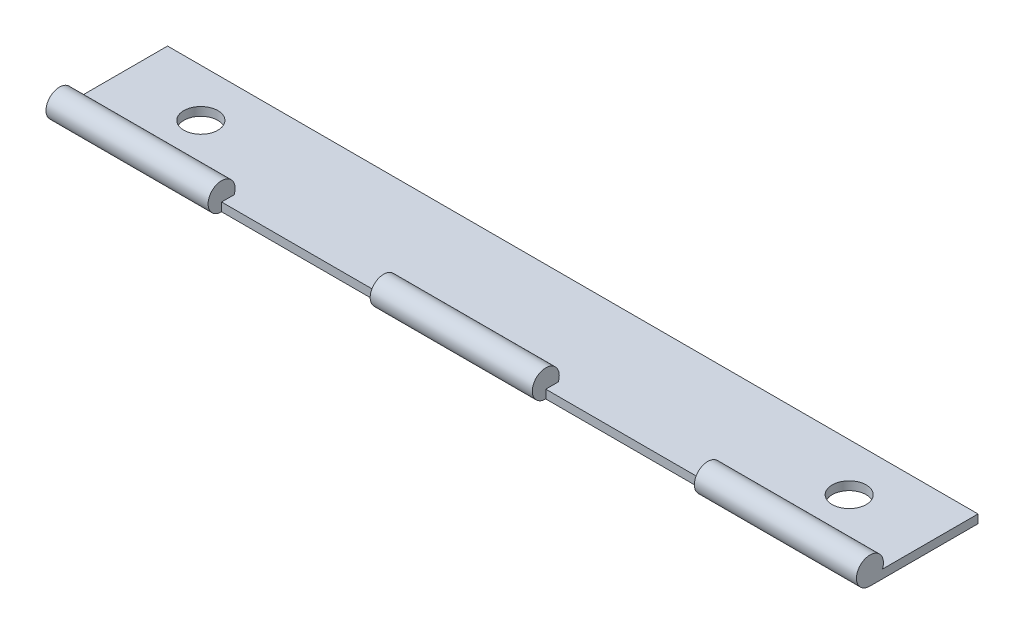
ISO-10303-21;
HEADER;
FILE_DESCRIPTION(('STEP AP214'),'2;1');
FILE_NAME('part.step','',(''),(''),'','','');
FILE_SCHEMA(('AUTOMOTIVE_DESIGN { 1 0 10303 214 1 1 1 1 }'));
ENDSEC;
DATA;
#1=APPLICATION_CONTEXT('core data for automotive mechanical design processes');
#2=APPLICATION_PROTOCOL_DEFINITION('international standard','automotive_design',2000,#1);
#3=PRODUCT_CONTEXT('',#1,'mechanical');
#4=PRODUCT('Part','Part','',(#3));
#5=PRODUCT_RELATED_PRODUCT_CATEGORY('part','',(#4));
#6=PRODUCT_DEFINITION_FORMATION('','',#4);
#7=PRODUCT_DEFINITION_CONTEXT('part definition',#1,'design');
#8=PRODUCT_DEFINITION('design','',#6,#7);
#9=PRODUCT_DEFINITION_SHAPE('','',#8);
#10=(LENGTH_UNIT() NAMED_UNIT(*) SI_UNIT(.MILLI.,.METRE.));
#11=(NAMED_UNIT(*) PLANE_ANGLE_UNIT() SI_UNIT($,.RADIAN.));
#12=(NAMED_UNIT(*) SI_UNIT($,.STERADIAN.) SOLID_ANGLE_UNIT());
#13=UNCERTAINTY_MEASURE_WITH_UNIT(LENGTH_MEASURE(1.E-05),#10,'distance_accuracy_value','');
#14=(GEOMETRIC_REPRESENTATION_CONTEXT(3) GLOBAL_UNCERTAINTY_ASSIGNED_CONTEXT((#13)) GLOBAL_UNIT_ASSIGNED_CONTEXT((#10,
#11,#12)) REPRESENTATION_CONTEXT('',''));
#15=CARTESIAN_POINT('',(0.,0.,0.));
#16=DIRECTION('',(0.,0.,1.));
#17=DIRECTION('',(1.,0.,0.));
#18=AXIS2_PLACEMENT_3D('',#15,#16,#17);
#19=CARTESIAN_POINT('',(0.,1.,0.));
#20=DIRECTION('',(0.,0.,-1.));
#21=DIRECTION('',(-1.,0.,0.));
#22=AXIS2_PLACEMENT_3D('',#19,#20,#21);
#23=PLANE('',#22);
#24=DIRECTION('',(0.,1.,0.));
#25=VECTOR('',#24,1.);
#26=CARTESIAN_POINT('',(57.15,1.,0.));
#27=LINE('',#26,#25);
#28=CARTESIAN_POINT('',(57.15,0.,0.));
#29=VERTEX_POINT('',#28);
#30=CARTESIAN_POINT('',(57.15,1.,0.));
#31=VERTEX_POINT('',#30);
#32=EDGE_CURVE('E156',#29,#31,#27,.T.);
#33=ORIENTED_EDGE('',*,*,#32,.F.);
#34=DIRECTION('',(1.,0.,0.));
#35=VECTOR('',#34,1.);
#36=CARTESIAN_POINT('',(0.,0.,0.));
#37=LINE('',#36,#35);
#38=CARTESIAN_POINT('',(76.2,0.,0.));
#39=VERTEX_POINT('',#38);
#40=EDGE_CURVE('E187',#29,#39,#37,.T.);
#41=ORIENTED_EDGE('',*,*,#40,.T.);
#42=DIRECTION('',(0.,-1.,0.));
#43=VECTOR('',#42,1.);
#44=CARTESIAN_POINT('',(76.2,1.,0.));
#45=LINE('',#44,#43);
#46=CARTESIAN_POINT('',(76.2,1.,0.));
#47=VERTEX_POINT('',#46);
#48=EDGE_CURVE('E161',#47,#39,#45,.T.);
#49=ORIENTED_EDGE('',*,*,#48,.F.);
#50=DIRECTION('',(1.,0.,0.));
#51=VECTOR('',#50,1.);
#52=CARTESIAN_POINT('',(0.,1.,0.));
#53=LINE('',#52,#51);
#54=EDGE_CURVE('E181',#31,#47,#53,.T.);
#55=ORIENTED_EDGE('',*,*,#54,.F.);
#56=EDGE_LOOP('',(#33,#41,#49,#55));
#57=FACE_BOUND('',#56,.T.);
#58=ADVANCED_FACE('F33',(#57),#23,.F.);
#59=CARTESIAN_POINT('',(0.,1.,0.));
#60=DIRECTION('',(0.,-1.,0.));
#61=DIRECTION('',(0.,0.,-1.));
#62=AXIS2_PLACEMENT_3D('',#59,#60,#61);
#63=PLANE('',#62);
#64=CARTESIAN_POINT('',(85.725,1.,-7.08739406018764));
#65=DIRECTION('',(0.,1.,0.));
#66=DIRECTION('',(0.,0.,1.));
#67=AXIS2_PLACEMENT_3D('',#64,#65,#66);
#68=CIRCLE('',#67,2.);
#69=CARTESIAN_POINT('',(85.725,1.,-5.08739406018764));
#70=VERTEX_POINT('',#69);
#71=EDGE_CURVE('E194',#70,#70,#68,.T.);
#72=ORIENTED_EDGE('',*,*,#71,.F.);
#73=EDGE_LOOP('',(#72));
#74=FACE_BOUND('',#73,.T.);
#75=CARTESIAN_POINT('',(9.52500000000001,1.,-7.08739406018764));
#76=DIRECTION('',(0.,1.,0.));
#77=DIRECTION('',(0.,0.,-1.));
#78=AXIS2_PLACEMENT_3D('',#75,#76,#77);
#79=CIRCLE('',#78,2.);
#80=CARTESIAN_POINT('',(9.52500000000001,1.,-5.08739406018764));
#81=VERTEX_POINT('',#80);
#82=EDGE_CURVE('E135',#81,#81,#79,.T.);
#83=ORIENTED_EDGE('',*,*,#82,.F.);
#84=EDGE_LOOP('',(#83));
#85=FACE_BOUND('',#84,.T.);
#86=DIRECTION('',(0.,0.,-1.));
#87=VECTOR('',#86,1.);
#88=CARTESIAN_POINT('',(57.15,1.,0.));
#89=LINE('',#88,#87);
#90=CARTESIAN_POINT('',(57.15,1.,-1.47478812037526));
#91=VERTEX_POINT('',#90);
#92=EDGE_CURVE('E154',#31,#91,#89,.T.);
#93=ORIENTED_EDGE('',*,*,#92,.F.);
#94=ORIENTED_EDGE('',*,*,#54,.T.);
#95=DIRECTION('',(0.,0.,-1.));
#96=VECTOR('',#95,1.);
#97=CARTESIAN_POINT('',(76.2,1.,0.));
#98=LINE('',#97,#96);
#99=CARTESIAN_POINT('',(76.2,1.,-1.47478812037527));
#100=VERTEX_POINT('',#99);
#101=EDGE_CURVE('E50',#47,#100,#98,.T.);
#102=ORIENTED_EDGE('',*,*,#101,.T.);
#103=DIRECTION('',(-1.,0.,0.));
#104=VECTOR('',#103,1.);
#105=CARTESIAN_POINT('',(95.25,0.999999999999999,-1.47478812037527));
#106=LINE('',#105,#104);
#107=CARTESIAN_POINT('',(95.25,0.999999999999999,-1.47478812037527));
#108=VERTEX_POINT('',#107);
#109=EDGE_CURVE('E121',#108,#100,#106,.T.);
#110=ORIENTED_EDGE('',*,*,#109,.F.);
#111=DIRECTION('',(0.,0.,1.));
#112=VECTOR('',#111,1.);
#113=CARTESIAN_POINT('',(95.25,1.,-12.7));
#114=LINE('',#113,#112);
#115=CARTESIAN_POINT('',(95.25,1.,-12.7));
#116=VERTEX_POINT('',#115);
#117=EDGE_CURVE('E119',#116,#108,#114,.T.);
#118=ORIENTED_EDGE('',*,*,#117,.F.);
#119=DIRECTION('',(-1.,0.,0.));
#120=VECTOR('',#119,1.);
#121=CARTESIAN_POINT('',(0.,1.,-12.7));
#122=LINE('',#121,#120);
#123=CARTESIAN_POINT('',(0.,1.,-12.7));
#124=VERTEX_POINT('',#123);
#125=EDGE_CURVE('E42',#116,#124,#122,.T.);
#126=ORIENTED_EDGE('',*,*,#125,.T.);
#127=DIRECTION('',(0.,0.,1.));
#128=VECTOR('',#127,1.);
#129=CARTESIAN_POINT('',(0.,1.,0.));
#130=LINE('',#129,#128);
#131=CARTESIAN_POINT('',(0.,1.,-1.47478812037526));
#132=VERTEX_POINT('',#131);
#133=EDGE_CURVE('E179',#124,#132,#130,.T.);
#134=ORIENTED_EDGE('',*,*,#133,.T.);
#135=DIRECTION('',(-1.,0.,0.));
#136=VECTOR('',#135,1.);
#137=CARTESIAN_POINT('',(19.05,1.,-1.47478812037526));
#138=LINE('',#137,#136);
#139=CARTESIAN_POINT('',(19.05,1.,-1.47478812037526));
#140=VERTEX_POINT('',#139);
#141=EDGE_CURVE('E176',#132,#140,#138,.F.);
#142=ORIENTED_EDGE('',*,*,#141,.T.);
#143=DIRECTION('',(0.,0.,-1.));
#144=VECTOR('',#143,1.);
#145=CARTESIAN_POINT('',(19.05,1.,0.));
#146=LINE('',#145,#144);
#147=CARTESIAN_POINT('',(19.05,1.,0.));
#148=VERTEX_POINT('',#147);
#149=EDGE_CURVE('E168',#148,#140,#146,.T.);
#150=ORIENTED_EDGE('',*,*,#149,.F.);
#151=CARTESIAN_POINT('',(38.1,1.,0.));
#152=VERTEX_POINT('',#151);
#153=EDGE_CURVE('E117',#148,#152,#53,.T.);
#154=ORIENTED_EDGE('',*,*,#153,.T.);
#155=DIRECTION('',(0.,0.,-1.));
#156=VECTOR('',#155,1.);
#157=CARTESIAN_POINT('',(38.1,1.,0.));
#158=LINE('',#157,#156);
#159=CARTESIAN_POINT('',(38.1,1.,-1.47478812037526));
#160=VERTEX_POINT('',#159);
#161=EDGE_CURVE('E148',#152,#160,#158,.T.);
#162=ORIENTED_EDGE('',*,*,#161,.T.);
#163=DIRECTION('',(-1.,0.,0.));
#164=VECTOR('',#163,1.);
#165=CARTESIAN_POINT('',(57.15,1.,-1.47478812037526));
#166=LINE('',#165,#164);
#167=EDGE_CURVE('E57',#160,#91,#166,.F.);
#168=ORIENTED_EDGE('',*,*,#167,.T.);
#169=EDGE_LOOP('',(#93,#94,#102,#110,#118,#126,#134,#142,#150,#154,#162,#168));
#170=FACE_BOUND('',#169,.T.);
#171=ADVANCED_FACE('F120',(#74,#85,#170),#63,.F.);
#172=CARTESIAN_POINT('',(19.05,0.,0.));
#173=VERTEX_POINT('',#172);
#174=CARTESIAN_POINT('',(38.1,0.,0.));
#175=VERTEX_POINT('',#174);
#176=EDGE_CURVE('E191',#173,#175,#37,.T.);
#177=ORIENTED_EDGE('',*,*,#176,.T.);
#178=DIRECTION('',(0.,1.,0.));
#179=VECTOR('',#178,1.);
#180=CARTESIAN_POINT('',(38.1,1.,0.));
#181=LINE('',#180,#179);
#182=EDGE_CURVE('E152',#175,#152,#181,.T.);
#183=ORIENTED_EDGE('',*,*,#182,.T.);
#184=ORIENTED_EDGE('',*,*,#153,.F.);
#185=DIRECTION('',(0.,1.,0.));
#186=VECTOR('',#185,1.);
#187=CARTESIAN_POINT('',(19.05,1.,0.));
#188=LINE('',#187,#186);
#189=EDGE_CURVE('E173',#173,#148,#188,.T.);
#190=ORIENTED_EDGE('',*,*,#189,.F.);
#191=EDGE_LOOP('',(#177,#183,#184,#190));
#192=FACE_BOUND('',#191,.T.);
#193=ADVANCED_FACE('F207',(#192),#23,.F.);
#194=CARTESIAN_POINT('',(0.,1.,0.));
#195=DIRECTION('',(1.,0.,0.));
#196=DIRECTION('',(0.,0.,-1.));
#197=AXIS2_PLACEMENT_3D('',#194,#195,#196);
#198=PLANE('',#197);
#199=DIRECTION('',(0.,0.,1.));
#200=VECTOR('',#199,1.);
#201=CARTESIAN_POINT('',(0.,0.,0.));
#202=LINE('',#201,#200);
#203=CARTESIAN_POINT('',(0.,0.,-12.7));
#204=VERTEX_POINT('',#203);
#205=CARTESIAN_POINT('',(0.,0.,0.));
#206=VERTEX_POINT('',#205);
#207=EDGE_CURVE('E178',#204,#206,#202,.T.);
#208=ORIENTED_EDGE('',*,*,#207,.T.);
#209=CARTESIAN_POINT('',(0.,1.5875,0.));
#210=DIRECTION('',(-1.,0.,0.));
#211=DIRECTION('',(0.,0.,1.));
#212=AXIS2_PLACEMENT_3D('',#209,#210,#211);
#213=CIRCLE('',#212,1.5875);
#214=EDGE_CURVE('E164',#206,#132,#213,.T.);
#215=ORIENTED_EDGE('',*,*,#214,.T.);
#216=ORIENTED_EDGE('',*,*,#133,.F.);
#217=DIRECTION('',(0.,-1.,0.));
#218=VECTOR('',#217,1.);
#219=CARTESIAN_POINT('',(0.,1.,-12.7));
#220=LINE('',#219,#218);
#221=EDGE_CURVE('E11',#124,#204,#220,.T.);
#222=ORIENTED_EDGE('',*,*,#221,.T.);
#223=EDGE_LOOP('',(#208,#215,#216,#222));
#224=FACE_BOUND('',#223,.T.);
#225=ADVANCED_FACE('F35',(#224),#198,.F.);
#226=CARTESIAN_POINT('',(0.,1.,-12.7));
#227=DIRECTION('',(0.,0.,1.));
#228=DIRECTION('',(1.,0.,0.));
#229=AXIS2_PLACEMENT_3D('',#226,#227,#228);
#230=PLANE('',#229);
#231=DIRECTION('',(-1.,0.,0.));
#232=VECTOR('',#231,1.);
#233=CARTESIAN_POINT('',(0.,0.,-12.7));
#234=LINE('',#233,#232);
#235=CARTESIAN_POINT('',(95.25,0.,-12.7));
#236=VERTEX_POINT('',#235);
#237=EDGE_CURVE('E182',#236,#204,#234,.T.);
#238=ORIENTED_EDGE('',*,*,#237,.T.);
#239=ORIENTED_EDGE('',*,*,#221,.F.);
#240=ORIENTED_EDGE('',*,*,#125,.F.);
#241=DIRECTION('',(0.,1.,0.));
#242=VECTOR('',#241,1.);
#243=CARTESIAN_POINT('',(95.25,0.,-12.7));
#244=LINE('',#243,#242);
#245=EDGE_CURVE('E115',#236,#116,#244,.T.);
#246=ORIENTED_EDGE('',*,*,#245,.F.);
#247=EDGE_LOOP('',(#238,#239,#240,#246));
#248=FACE_BOUND('',#247,.T.);
#249=ADVANCED_FACE('F113',(#248),#230,.F.);
#250=CARTESIAN_POINT('',(0.,0.,0.));
#251=DIRECTION('',(0.,-1.,0.));
#252=DIRECTION('',(0.,0.,-1.));
#253=AXIS2_PLACEMENT_3D('',#250,#251,#252);
#254=PLANE('',#253);
#255=CARTESIAN_POINT('',(85.725,0.,-7.08739406018764));
#256=DIRECTION('',(0.,-1.,0.));
#257=DIRECTION('',(0.,0.,-1.));
#258=AXIS2_PLACEMENT_3D('',#255,#256,#257);
#259=CIRCLE('',#258,2.);
#260=CARTESIAN_POINT('',(85.725,0.,-5.08739406018764));
#261=VERTEX_POINT('',#260);
#262=EDGE_CURVE('E37',#261,#261,#259,.T.);
#263=ORIENTED_EDGE('',*,*,#262,.F.);
#264=EDGE_LOOP('',(#263));
#265=FACE_BOUND('',#264,.T.);
#266=CARTESIAN_POINT('',(9.52500000000001,0.,-7.08739406018764));
#267=DIRECTION('',(0.,-1.,0.));
#268=DIRECTION('',(0.,0.,-1.));
#269=AXIS2_PLACEMENT_3D('',#266,#267,#268);
#270=CIRCLE('',#269,2.);
#271=CARTESIAN_POINT('',(9.52500000000001,0.,-5.08739406018764));
#272=VERTEX_POINT('',#271);
#273=EDGE_CURVE('E192',#272,#272,#270,.T.);
#274=ORIENTED_EDGE('',*,*,#273,.F.);
#275=EDGE_LOOP('',(#274));
#276=FACE_BOUND('',#275,.T.);
#277=ORIENTED_EDGE('',*,*,#207,.F.);
#278=ORIENTED_EDGE('',*,*,#237,.F.);
#279=DIRECTION('',(0.,0.,-1.));
#280=VECTOR('',#279,1.);
#281=CARTESIAN_POINT('',(95.25,0.,-12.7));
#282=LINE('',#281,#280);
#283=CARTESIAN_POINT('',(95.25,0.,0.));
#284=VERTEX_POINT('',#283);
#285=EDGE_CURVE('E129',#284,#236,#282,.T.);
#286=ORIENTED_EDGE('',*,*,#285,.F.);
#287=DIRECTION('',(-1.,0.,0.));
#288=VECTOR('',#287,1.);
#289=CARTESIAN_POINT('',(95.25,0.,0.));
#290=LINE('',#289,#288);
#291=EDGE_CURVE('E139',#284,#39,#290,.T.);
#292=ORIENTED_EDGE('',*,*,#291,.T.);
#293=ORIENTED_EDGE('',*,*,#40,.F.);
#294=EDGE_CURVE('E252',#175,#29,#37,.T.);
#295=ORIENTED_EDGE('',*,*,#294,.F.);
#296=ORIENTED_EDGE('',*,*,#176,.F.);
#297=EDGE_CURVE('E188',#206,#173,#37,.T.);
#298=ORIENTED_EDGE('',*,*,#297,.F.);
#299=EDGE_LOOP('',(#277,#278,#286,#292,#293,#295,#296,#298));
#300=FACE_BOUND('',#299,.T.);
#301=ADVANCED_FACE('F222',(#265,#276,#300),#254,.T.);
#302=CARTESIAN_POINT('',(19.05,1.5875,0.));
#303=DIRECTION('',(-1.,0.,0.));
#304=DIRECTION('',(0.,0.,1.));
#305=AXIS2_PLACEMENT_3D('',#302,#303,#304);
#306=CYLINDRICAL_SURFACE('',#305,1.5875);
#307=ORIENTED_EDGE('',*,*,#141,.F.);
#308=ORIENTED_EDGE('',*,*,#214,.F.);
#309=ORIENTED_EDGE('',*,*,#297,.T.);
#310=CARTESIAN_POINT('',(19.05,1.5875,0.));
#311=DIRECTION('',(-1.,0.,0.));
#312=DIRECTION('',(0.,0.,1.));
#313=AXIS2_PLACEMENT_3D('',#310,#311,#312);
#314=CIRCLE('',#313,1.5875);
#315=EDGE_CURVE('E165',#173,#140,#314,.T.);
#316=ORIENTED_EDGE('',*,*,#315,.T.);
#317=EDGE_LOOP('',(#307,#308,#309,#316));
#318=FACE_BOUND('',#317,.T.);
#319=ADVANCED_FACE('F220',(#318),#306,.T.);
#320=CARTESIAN_POINT('',(19.05,1.5875,0.));
#321=DIRECTION('',(-1.,0.,0.));
#322=DIRECTION('',(0.,0.,1.));
#323=AXIS2_PLACEMENT_3D('',#320,#321,#322);
#324=PLANE('',#323);
#325=ORIENTED_EDGE('',*,*,#315,.F.);
#326=ORIENTED_EDGE('',*,*,#189,.T.);
#327=ORIENTED_EDGE('',*,*,#149,.T.);
#328=EDGE_LOOP('',(#325,#326,#327));
#329=FACE_BOUND('',#328,.T.);
#330=ADVANCED_FACE('F241',(#329),#324,.F.);
#331=CARTESIAN_POINT('',(57.15,1.5875,0.));
#332=DIRECTION('',(-1.,0.,0.));
#333=DIRECTION('',(0.,0.,1.));
#334=AXIS2_PLACEMENT_3D('',#331,#332,#333);
#335=CYLINDRICAL_SURFACE('',#334,1.5875);
#336=ORIENTED_EDGE('',*,*,#167,.F.);
#337=CARTESIAN_POINT('',(38.1,1.5875,0.));
#338=DIRECTION('',(-1.,0.,0.));
#339=DIRECTION('',(0.,0.,1.));
#340=AXIS2_PLACEMENT_3D('',#337,#338,#339);
#341=CIRCLE('',#340,1.5875);
#342=EDGE_CURVE('E144',#175,#160,#341,.T.);
#343=ORIENTED_EDGE('',*,*,#342,.F.);
#344=ORIENTED_EDGE('',*,*,#294,.T.);
#345=CARTESIAN_POINT('',(57.15,1.5875,0.));
#346=DIRECTION('',(-1.,0.,0.));
#347=DIRECTION('',(0.,0.,1.));
#348=AXIS2_PLACEMENT_3D('',#345,#346,#347);
#349=CIRCLE('',#348,1.5875);
#350=EDGE_CURVE('E145',#29,#91,#349,.T.);
#351=ORIENTED_EDGE('',*,*,#350,.T.);
#352=EDGE_LOOP('',(#336,#343,#344,#351));
#353=FACE_BOUND('',#352,.T.);
#354=ADVANCED_FACE('F251',(#353),#335,.T.);
#355=CARTESIAN_POINT('',(57.15,1.5875,0.));
#356=DIRECTION('',(-1.,0.,0.));
#357=DIRECTION('',(0.,0.,1.));
#358=AXIS2_PLACEMENT_3D('',#355,#356,#357);
#359=PLANE('',#358);
#360=ORIENTED_EDGE('',*,*,#350,.F.);
#361=ORIENTED_EDGE('',*,*,#32,.T.);
#362=ORIENTED_EDGE('',*,*,#92,.T.);
#363=EDGE_LOOP('',(#360,#361,#362));
#364=FACE_BOUND('',#363,.T.);
#365=ADVANCED_FACE('F255',(#364),#359,.F.);
#366=CARTESIAN_POINT('',(38.1,1.5875,0.));
#367=DIRECTION('',(-1.,0.,0.));
#368=DIRECTION('',(0.,0.,1.));
#369=AXIS2_PLACEMENT_3D('',#366,#367,#368);
#370=PLANE('',#369);
#371=ORIENTED_EDGE('',*,*,#182,.F.);
#372=ORIENTED_EDGE('',*,*,#342,.T.);
#373=ORIENTED_EDGE('',*,*,#161,.F.);
#374=EDGE_LOOP('',(#371,#372,#373));
#375=FACE_BOUND('',#374,.T.);
#376=ADVANCED_FACE('F247',(#375),#370,.T.);
#377=CARTESIAN_POINT('',(76.2,1.5875,0.));
#378=DIRECTION('',(1.,0.,0.));
#379=DIRECTION('',(0.,0.,-1.));
#380=AXIS2_PLACEMENT_3D('',#377,#378,#379);
#381=PLANE('',#380);
#382=ORIENTED_EDGE('',*,*,#101,.F.);
#383=ORIENTED_EDGE('',*,*,#48,.T.);
#384=CARTESIAN_POINT('',(76.2,1.5875,0.));
#385=DIRECTION('',(1.,0.,0.));
#386=DIRECTION('',(0.,0.,-1.));
#387=AXIS2_PLACEMENT_3D('',#384,#385,#386);
#388=CIRCLE('',#387,1.5875);
#389=EDGE_CURVE('E130',#100,#39,#388,.T.);
#390=ORIENTED_EDGE('',*,*,#389,.F.);
#391=EDGE_LOOP('',(#382,#383,#390));
#392=FACE_BOUND('',#391,.T.);
#393=ADVANCED_FACE('F261',(#392),#381,.F.);
#394=CARTESIAN_POINT('',(95.25,1.5875,0.));
#395=DIRECTION('',(-1.,0.,0.));
#396=DIRECTION('',(0.,0.,1.));
#397=AXIS2_PLACEMENT_3D('',#394,#395,#396);
#398=CYLINDRICAL_SURFACE('',#397,1.5875);
#399=ORIENTED_EDGE('',*,*,#389,.T.);
#400=ORIENTED_EDGE('',*,*,#291,.F.);
#401=CARTESIAN_POINT('',(95.25,1.5875,0.));
#402=DIRECTION('',(1.,0.,0.));
#403=DIRECTION('',(0.,0.,-1.));
#404=AXIS2_PLACEMENT_3D('',#401,#402,#403);
#405=CIRCLE('',#404,1.5875);
#406=EDGE_CURVE('E124',#108,#284,#405,.T.);
#407=ORIENTED_EDGE('',*,*,#406,.F.);
#408=ORIENTED_EDGE('',*,*,#109,.T.);
#409=EDGE_LOOP('',(#399,#400,#407,#408));
#410=FACE_BOUND('',#409,.T.);
#411=ADVANCED_FACE('F264',(#410),#398,.T.);
#412=CARTESIAN_POINT('',(95.25,1.5875,0.));
#413=DIRECTION('',(1.,0.,0.));
#414=DIRECTION('',(0.,0.,-1.));
#415=AXIS2_PLACEMENT_3D('',#412,#413,#414);
#416=PLANE('',#415);
#417=ORIENTED_EDGE('',*,*,#245,.T.);
#418=ORIENTED_EDGE('',*,*,#117,.T.);
#419=ORIENTED_EDGE('',*,*,#406,.T.);
#420=ORIENTED_EDGE('',*,*,#285,.T.);
#421=EDGE_LOOP('',(#417,#418,#419,#420));
#422=FACE_BOUND('',#421,.T.);
#423=ADVANCED_FACE('F127',(#422),#416,.T.);
#424=CARTESIAN_POINT('',(9.52500000000001,-18.05,-7.08739406018764));
#425=DIRECTION('',(0.,1.,0.));
#426=DIRECTION('',(0.,0.,1.));
#427=AXIS2_PLACEMENT_3D('',#424,#425,#426);
#428=CYLINDRICAL_SURFACE('',#427,2.);
#429=CARTESIAN_POINT('',(9.52500000000001,0.,-5.08739406018764));
#430=CARTESIAN_POINT('',(9.52500000000001,0.0104166666666667,-5.08739406018764));
#431=CARTESIAN_POINT('',(9.52500000000001,0.0208333333333333,-5.08739406018764));
#432=CARTESIAN_POINT('',(9.52500000000001,0.0416666666666667,-5.08739406018764));
#433=CARTESIAN_POINT('',(9.52500000000001,0.0520833333333334,-5.08739406018764));
#434=CARTESIAN_POINT('',(9.52500000000001,0.0729166666666667,-5.08739406018764));
#435=CARTESIAN_POINT('',(9.52500000000001,0.0833333333333334,-5.08739406018764));
#436=CARTESIAN_POINT('',(9.52500000000001,0.104166666666667,-5.08739406018764));
#437=CARTESIAN_POINT('',(9.52500000000001,0.114583333333333,-5.08739406018764));
#438=CARTESIAN_POINT('',(9.52500000000001,0.135416666666667,-5.08739406018764));
#439=CARTESIAN_POINT('',(9.52500000000001,0.145833333333333,-5.08739406018764));
#440=CARTESIAN_POINT('',(9.52500000000001,0.166666666666667,-5.08739406018764));
#441=CARTESIAN_POINT('',(9.52500000000001,0.177083333333333,-5.08739406018764));
#442=CARTESIAN_POINT('',(9.52500000000001,0.197916666666667,-5.08739406018764));
#443=CARTESIAN_POINT('',(9.52500000000001,0.208333333333334,-5.08739406018764));
#444=CARTESIAN_POINT('',(9.52500000000001,0.229166666666667,-5.08739406018764));
#445=CARTESIAN_POINT('',(9.52500000000001,0.239583333333334,-5.08739406018764));
#446=CARTESIAN_POINT('',(9.52500000000001,0.260416666666667,-5.08739406018764));
#447=CARTESIAN_POINT('',(9.52500000000001,0.270833333333334,-5.08739406018764));
#448=CARTESIAN_POINT('',(9.52500000000001,0.291666666666667,-5.08739406018764));
#449=CARTESIAN_POINT('',(9.52500000000001,0.302083333333334,-5.08739406018764));
#450=CARTESIAN_POINT('',(9.52500000000001,0.322916666666667,-5.08739406018764));
#451=CARTESIAN_POINT('',(9.52500000000001,0.333333333333334,-5.08739406018764));
#452=CARTESIAN_POINT('',(9.52500000000001,0.354166666666667,-5.08739406018764));
#453=CARTESIAN_POINT('',(9.52500000000001,0.364583333333334,-5.08739406018764));
#454=CARTESIAN_POINT('',(9.52500000000001,0.385416666666667,-5.08739406018764));
#455=CARTESIAN_POINT('',(9.52500000000001,0.395833333333334,-5.08739406018764));
#456=CARTESIAN_POINT('',(9.52500000000001,0.416666666666667,-5.08739406018764));
#457=CARTESIAN_POINT('',(9.52500000000001,0.427083333333334,-5.08739406018764));
#458=CARTESIAN_POINT('',(9.52500000000001,0.447916666666667,-5.08739406018764));
#459=CARTESIAN_POINT('',(9.52500000000001,0.458333333333334,-5.08739406018764));
#460=CARTESIAN_POINT('',(9.52500000000001,0.479166666666667,-5.08739406018764));
#461=CARTESIAN_POINT('',(9.52500000000001,0.489583333333334,-5.08739406018764));
#462=CARTESIAN_POINT('',(9.52500000000001,0.510416666666667,-5.08739406018764));
#463=CARTESIAN_POINT('',(9.52500000000001,0.520833333333334,-5.08739406018764));
#464=CARTESIAN_POINT('',(9.52500000000001,0.541666666666667,-5.08739406018764));
#465=CARTESIAN_POINT('',(9.52500000000001,0.552083333333334,-5.08739406018764));
#466=CARTESIAN_POINT('',(9.52500000000001,0.572916666666667,-5.08739406018764));
#467=CARTESIAN_POINT('',(9.52500000000001,0.583333333333334,-5.08739406018764));
#468=CARTESIAN_POINT('',(9.52500000000001,0.604166666666667,-5.08739406018764));
#469=CARTESIAN_POINT('',(9.52500000000001,0.614583333333334,-5.08739406018764));
#470=CARTESIAN_POINT('',(9.52500000000001,0.635416666666667,-5.08739406018764));
#471=CARTESIAN_POINT('',(9.52500000000001,0.645833333333334,-5.08739406018764));
#472=CARTESIAN_POINT('',(9.52500000000001,0.666666666666667,-5.08739406018764));
#473=CARTESIAN_POINT('',(9.52500000000001,0.677083333333334,-5.08739406018764));
#474=CARTESIAN_POINT('',(9.52500000000001,0.697916666666667,-5.08739406018764));
#475=CARTESIAN_POINT('',(9.52500000000001,0.708333333333334,-5.08739406018764));
#476=CARTESIAN_POINT('',(9.52500000000001,0.729166666666667,-5.08739406018764));
#477=CARTESIAN_POINT('',(9.52500000000001,0.739583333333334,-5.08739406018764));
#478=CARTESIAN_POINT('',(9.52500000000001,0.760416666666667,-5.08739406018764));
#479=CARTESIAN_POINT('',(9.52500000000001,0.770833333333334,-5.08739406018764));
#480=CARTESIAN_POINT('',(9.52500000000001,0.791666666666667,-5.08739406018764));
#481=CARTESIAN_POINT('',(9.52500000000001,0.802083333333334,-5.08739406018764));
#482=CARTESIAN_POINT('',(9.52500000000001,0.822916666666667,-5.08739406018764));
#483=CARTESIAN_POINT('',(9.52500000000001,0.833333333333334,-5.08739406018764));
#484=CARTESIAN_POINT('',(9.52500000000001,0.854166666666667,-5.08739406018764));
#485=CARTESIAN_POINT('',(9.52500000000001,0.864583333333334,-5.08739406018764));
#486=CARTESIAN_POINT('',(9.52500000000001,0.885416666666668,-5.08739406018764));
#487=CARTESIAN_POINT('',(9.52500000000001,0.895833333333334,-5.08739406018764));
#488=CARTESIAN_POINT('',(9.52500000000001,0.916666666666668,-5.08739406018764));
#489=CARTESIAN_POINT('',(9.52500000000001,0.927083333333334,-5.08739406018764));
#490=CARTESIAN_POINT('',(9.52500000000001,0.947916666666668,-5.08739406018764));
#491=CARTESIAN_POINT('',(9.52500000000001,0.958333333333334,-5.08739406018764));
#492=CARTESIAN_POINT('',(9.52500000000001,0.979166666666668,-5.08739406018764));
#493=CARTESIAN_POINT('',(9.52500000000001,0.989583333333334,-5.08739406018764));
#494=CARTESIAN_POINT('',(9.52500000000001,1.,-5.08739406018764));
#495=B_SPLINE_CURVE_WITH_KNOTS('',3,(#429,#430,#431,#432,#433,#434,#435,#436,#437,#438,#439,
#440,#441,#442,#443,#444,#445,#446,#447,#448,#449,#450,#451,#452,#453,#454,#455,#456,#457,#458,
#459,#460,#461,#462,#463,#464,#465,#466,#467,#468,#469,#470,#471,#472,#473,#474,#475,#476,#477,
#478,#479,#480,#481,#482,#483,#484,#485,#486,#487,#488,#489,#490,#491,#492,#493,#494),
.UNSPECIFIED.,.F.,.F.,(4,2,2,2,2,2,2,2,2,2,2,2,2,2,2,2,2,2,2,2,2,2,2,2,2,2,2,2,2,2,2,2,4),(0.,
0.03125,0.0625000000000001,0.0937500000000001,0.125,0.15625,0.1875,0.21875,0.25,0.28125,0.3125,
0.34375,0.375,0.40625,0.4375,0.46875,0.5,0.53125,0.5625,0.593750000000001,0.625000000000001,
0.656250000000001,0.687500000000001,0.718750000000001,0.750000000000001,0.781250000000001,
0.812500000000001,0.843750000000001,0.875000000000001,0.906250000000001,0.937500000000001,
0.968750000000001,1.),.UNSPECIFIED.);
#496=EDGE_CURVE('BSEAM204',#272,#81,#495,.T.);
#497=ORIENTED_EDGE('',*,*,#273,.T.);
#498=ORIENTED_EDGE('',*,*,#82,.T.);
#499=ORIENTED_EDGE('',*,*,#496,.T.);
#500=ORIENTED_EDGE('',*,*,#496,.F.);
#501=EDGE_LOOP('',(#497,#499,#498,#500));
#502=FACE_BOUND('',#501,.T.);
#503=ADVANCED_FACE('F204',(#502),#428,.F.);
#504=CARTESIAN_POINT('',(85.725,-18.05,-7.08739406018764));
#505=DIRECTION('',(0.,1.,0.));
#506=DIRECTION('',(0.,0.,1.));
#507=AXIS2_PLACEMENT_3D('',#504,#505,#506);
#508=CYLINDRICAL_SURFACE('',#507,2.);
#509=CARTESIAN_POINT('',(85.725,0.,-5.08739406018764));
#510=CARTESIAN_POINT('',(85.725,0.0104166666666667,-5.08739406018764));
#511=CARTESIAN_POINT('',(85.725,0.0208333333333333,-5.08739406018764));
#512=CARTESIAN_POINT('',(85.725,0.0416666666666667,-5.08739406018764));
#513=CARTESIAN_POINT('',(85.725,0.0520833333333334,-5.08739406018764));
#514=CARTESIAN_POINT('',(85.725,0.0729166666666667,-5.08739406018764));
#515=CARTESIAN_POINT('',(85.725,0.0833333333333334,-5.08739406018764));
#516=CARTESIAN_POINT('',(85.725,0.104166666666667,-5.08739406018764));
#517=CARTESIAN_POINT('',(85.725,0.114583333333333,-5.08739406018764));
#518=CARTESIAN_POINT('',(85.725,0.135416666666667,-5.08739406018764));
#519=CARTESIAN_POINT('',(85.725,0.145833333333333,-5.08739406018764));
#520=CARTESIAN_POINT('',(85.725,0.166666666666667,-5.08739406018764));
#521=CARTESIAN_POINT('',(85.725,0.177083333333333,-5.08739406018764));
#522=CARTESIAN_POINT('',(85.725,0.197916666666667,-5.08739406018764));
#523=CARTESIAN_POINT('',(85.725,0.208333333333334,-5.08739406018764));
#524=CARTESIAN_POINT('',(85.725,0.229166666666667,-5.08739406018764));
#525=CARTESIAN_POINT('',(85.725,0.239583333333334,-5.08739406018764));
#526=CARTESIAN_POINT('',(85.725,0.260416666666667,-5.08739406018764));
#527=CARTESIAN_POINT('',(85.725,0.270833333333334,-5.08739406018764));
#528=CARTESIAN_POINT('',(85.725,0.291666666666667,-5.08739406018764));
#529=CARTESIAN_POINT('',(85.725,0.302083333333334,-5.08739406018764));
#530=CARTESIAN_POINT('',(85.725,0.322916666666667,-5.08739406018764));
#531=CARTESIAN_POINT('',(85.725,0.333333333333334,-5.08739406018764));
#532=CARTESIAN_POINT('',(85.725,0.354166666666667,-5.08739406018764));
#533=CARTESIAN_POINT('',(85.725,0.364583333333334,-5.08739406018764));
#534=CARTESIAN_POINT('',(85.725,0.385416666666667,-5.08739406018764));
#535=CARTESIAN_POINT('',(85.725,0.395833333333334,-5.08739406018764));
#536=CARTESIAN_POINT('',(85.725,0.416666666666667,-5.08739406018764));
#537=CARTESIAN_POINT('',(85.725,0.427083333333334,-5.08739406018764));
#538=CARTESIAN_POINT('',(85.725,0.447916666666667,-5.08739406018764));
#539=CARTESIAN_POINT('',(85.725,0.458333333333334,-5.08739406018764));
#540=CARTESIAN_POINT('',(85.725,0.479166666666667,-5.08739406018764));
#541=CARTESIAN_POINT('',(85.725,0.489583333333334,-5.08739406018764));
#542=CARTESIAN_POINT('',(85.725,0.510416666666667,-5.08739406018764));
#543=CARTESIAN_POINT('',(85.725,0.520833333333334,-5.08739406018764));
#544=CARTESIAN_POINT('',(85.725,0.541666666666667,-5.08739406018764));
#545=CARTESIAN_POINT('',(85.725,0.552083333333334,-5.08739406018764));
#546=CARTESIAN_POINT('',(85.725,0.572916666666667,-5.08739406018764));
#547=CARTESIAN_POINT('',(85.725,0.583333333333334,-5.08739406018764));
#548=CARTESIAN_POINT('',(85.725,0.604166666666667,-5.08739406018764));
#549=CARTESIAN_POINT('',(85.725,0.614583333333334,-5.08739406018764));
#550=CARTESIAN_POINT('',(85.725,0.635416666666667,-5.08739406018764));
#551=CARTESIAN_POINT('',(85.725,0.645833333333334,-5.08739406018764));
#552=CARTESIAN_POINT('',(85.725,0.666666666666667,-5.08739406018764));
#553=CARTESIAN_POINT('',(85.725,0.677083333333334,-5.08739406018764));
#554=CARTESIAN_POINT('',(85.725,0.697916666666667,-5.08739406018764));
#555=CARTESIAN_POINT('',(85.725,0.708333333333334,-5.08739406018764));
#556=CARTESIAN_POINT('',(85.725,0.729166666666667,-5.08739406018764));
#557=CARTESIAN_POINT('',(85.725,0.739583333333334,-5.08739406018764));
#558=CARTESIAN_POINT('',(85.725,0.760416666666667,-5.08739406018764));
#559=CARTESIAN_POINT('',(85.725,0.770833333333334,-5.08739406018764));
#560=CARTESIAN_POINT('',(85.725,0.791666666666667,-5.08739406018764));
#561=CARTESIAN_POINT('',(85.725,0.802083333333334,-5.08739406018764));
#562=CARTESIAN_POINT('',(85.725,0.822916666666667,-5.08739406018764));
#563=CARTESIAN_POINT('',(85.725,0.833333333333334,-5.08739406018764));
#564=CARTESIAN_POINT('',(85.725,0.854166666666667,-5.08739406018764));
#565=CARTESIAN_POINT('',(85.725,0.864583333333334,-5.08739406018764));
#566=CARTESIAN_POINT('',(85.725,0.885416666666668,-5.08739406018764));
#567=CARTESIAN_POINT('',(85.725,0.895833333333334,-5.08739406018764));
#568=CARTESIAN_POINT('',(85.725,0.916666666666668,-5.08739406018764));
#569=CARTESIAN_POINT('',(85.725,0.927083333333334,-5.08739406018764));
#570=CARTESIAN_POINT('',(85.725,0.947916666666668,-5.08739406018764));
#571=CARTESIAN_POINT('',(85.725,0.958333333333334,-5.08739406018764));
#572=CARTESIAN_POINT('',(85.725,0.979166666666668,-5.08739406018764));
#573=CARTESIAN_POINT('',(85.725,0.989583333333334,-5.08739406018764));
#574=CARTESIAN_POINT('',(85.725,1.,-5.08739406018764));
#575=B_SPLINE_CURVE_WITH_KNOTS('',3,(#509,#510,#511,#512,#513,#514,#515,#516,#517,#518,#519,
#520,#521,#522,#523,#524,#525,#526,#527,#528,#529,#530,#531,#532,#533,#534,#535,#536,#537,#538,
#539,#540,#541,#542,#543,#544,#545,#546,#547,#548,#549,#550,#551,#552,#553,#554,#555,#556,#557,
#558,#559,#560,#561,#562,#563,#564,#565,#566,#567,#568,#569,#570,#571,#572,#573,#574),
.UNSPECIFIED.,.F.,.F.,(4,2,2,2,2,2,2,2,2,2,2,2,2,2,2,2,2,2,2,2,2,2,2,2,2,2,2,2,2,2,2,2,4),(0.,
0.03125,0.0625000000000001,0.0937500000000001,0.125,0.15625,0.1875,0.21875,0.25,0.28125,0.3125,
0.34375,0.375,0.40625,0.4375,0.46875,0.5,0.53125,0.5625,0.593750000000001,0.625000000000001,
0.656250000000001,0.687500000000001,0.718750000000001,0.750000000000001,0.781250000000001,
0.812500000000001,0.843750000000001,0.875000000000001,0.906250000000001,0.937500000000001,
0.968750000000001,1.),.UNSPECIFIED.);
#576=EDGE_CURVE('BSEAM300',#261,#70,#575,.T.);
#577=ORIENTED_EDGE('',*,*,#262,.T.);
#578=ORIENTED_EDGE('',*,*,#71,.T.);
#579=ORIENTED_EDGE('',*,*,#576,.T.);
#580=ORIENTED_EDGE('',*,*,#576,.F.);
#581=EDGE_LOOP('',(#577,#579,#578,#580));
#582=FACE_BOUND('',#581,.T.);
#583=ADVANCED_FACE('F300',(#582),#508,.F.);
#584=CLOSED_SHELL('',(#58,#171,#193,#225,#249,#301,#319,#330,#354,#365,#376,#393,#411,#423,#503,#583));
#585=MANIFOLD_SOLID_BREP('B2',#584);
#586=ADVANCED_BREP_SHAPE_REPRESENTATION('',(#18,#585),#14);
#587=SHAPE_DEFINITION_REPRESENTATION(#9,#586);
ENDSEC;
END-ISO-10303-21;
